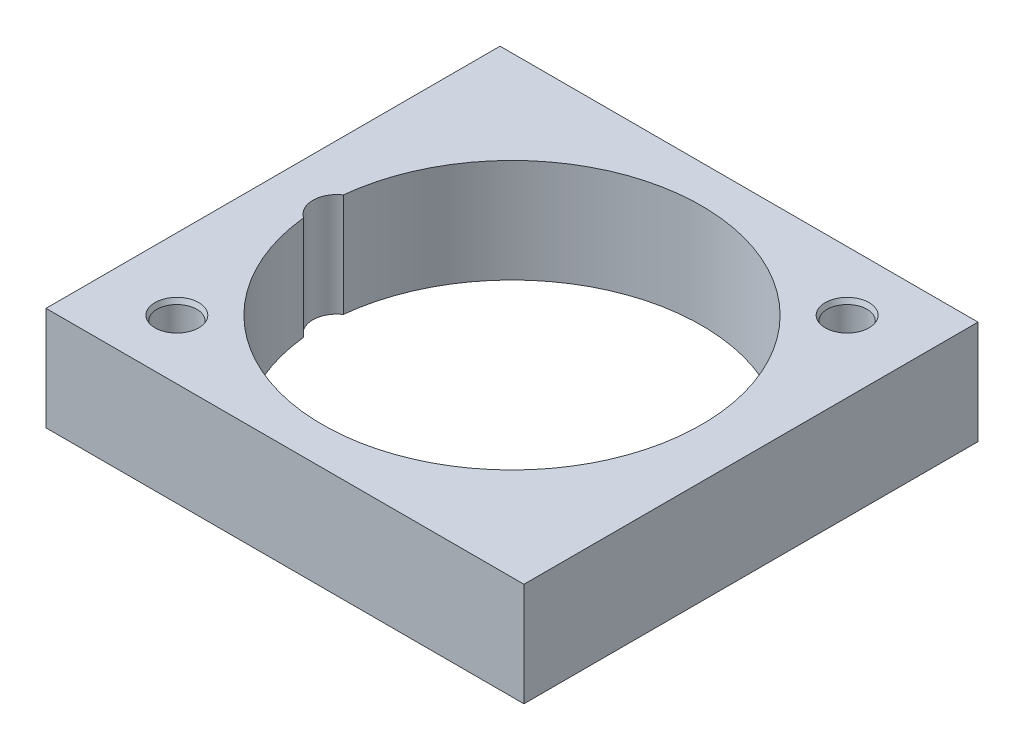
ISO-10303-21;
HEADER;
FILE_DESCRIPTION(('STEP AP214'),'2;1');
FILE_NAME('part.step','',(''),(''),'','','');
FILE_SCHEMA(('AUTOMOTIVE_DESIGN { 1 0 10303 214 1 1 1 1 }'));
ENDSEC;
DATA;
#1=APPLICATION_CONTEXT('core data for automotive mechanical design processes');
#2=APPLICATION_PROTOCOL_DEFINITION('international standard','automotive_design',2000,#1);
#3=PRODUCT_CONTEXT('',#1,'mechanical');
#4=PRODUCT('Part','Part','',(#3));
#5=PRODUCT_RELATED_PRODUCT_CATEGORY('part','',(#4));
#6=PRODUCT_DEFINITION_FORMATION('','',#4);
#7=PRODUCT_DEFINITION_CONTEXT('part definition',#1,'design');
#8=PRODUCT_DEFINITION('design','',#6,#7);
#9=PRODUCT_DEFINITION_SHAPE('','',#8);
#10=(LENGTH_UNIT() NAMED_UNIT(*) SI_UNIT(.MILLI.,.METRE.));
#11=(NAMED_UNIT(*) PLANE_ANGLE_UNIT() SI_UNIT($,.RADIAN.));
#12=(NAMED_UNIT(*) SI_UNIT($,.STERADIAN.) SOLID_ANGLE_UNIT());
#13=UNCERTAINTY_MEASURE_WITH_UNIT(LENGTH_MEASURE(1.E-05),#10,'distance_accuracy_value','');
#14=(GEOMETRIC_REPRESENTATION_CONTEXT(3) GLOBAL_UNCERTAINTY_ASSIGNED_CONTEXT((#13)) GLOBAL_UNIT_ASSIGNED_CONTEXT((#10,
#11,#12)) REPRESENTATION_CONTEXT('',''));
#15=CARTESIAN_POINT('',(0.,0.,0.));
#16=DIRECTION('',(0.,0.,1.));
#17=DIRECTION('',(1.,0.,0.));
#18=AXIS2_PLACEMENT_3D('',#15,#16,#17);
#19=CARTESIAN_POINT('',(30.,13.,-28.5));
#20=DIRECTION('',(0.,1.,0.));
#21=DIRECTION('',(0.,0.,1.));
#22=AXIS2_PLACEMENT_3D('',#19,#20,#21);
#23=PLANE('',#22);
#24=CARTESIAN_POINT('',(-21.0364267402999,13.,21.0364267402997));
#25=DIRECTION('',(0.,1.,0.));
#26=DIRECTION('',(0.,0.,1.));
#27=AXIS2_PLACEMENT_3D('',#24,#25,#26);
#28=CIRCLE('',#27,2.75);
#29=CARTESIAN_POINT('',(-21.0364267402999,13.,23.7864267402997));
#30=VERTEX_POINT('',#29);
#31=EDGE_CURVE('E105',#30,#30,#28,.T.);
#32=ORIENTED_EDGE('',*,*,#31,.F.);
#33=EDGE_LOOP('',(#32));
#34=FACE_BOUND('',#33,.T.);
#35=CARTESIAN_POINT('',(21.0364267402997,13.,-21.0364267402998));
#36=DIRECTION('',(0.,1.,0.));
#37=DIRECTION('',(0.,0.,1.));
#38=AXIS2_PLACEMENT_3D('',#35,#36,#37);
#39=CIRCLE('',#38,2.75);
#40=CARTESIAN_POINT('',(21.0364267402997,13.,-18.2864267402998));
#41=VERTEX_POINT('',#40);
#42=EDGE_CURVE('E116',#41,#41,#39,.T.);
#43=ORIENTED_EDGE('',*,*,#42,.F.);
#44=EDGE_LOOP('',(#43));
#45=FACE_BOUND('',#44,.T.);
#46=DIRECTION('',(0.,0.,-1.));
#47=VECTOR('',#46,1.);
#48=CARTESIAN_POINT('',(30.,13.,28.5));
#49=LINE('',#48,#47);
#50=CARTESIAN_POINT('',(30.,13.,28.5));
#51=VERTEX_POINT('',#50);
#52=CARTESIAN_POINT('',(30.,13.,-28.5));
#53=VERTEX_POINT('',#52);
#54=EDGE_CURVE('E141',#51,#53,#49,.T.);
#55=ORIENTED_EDGE('',*,*,#54,.T.);
#56=DIRECTION('',(-1.,0.,0.));
#57=VECTOR('',#56,1.);
#58=CARTESIAN_POINT('',(30.,13.,-28.5));
#59=LINE('',#58,#57);
#60=CARTESIAN_POINT('',(-30.,13.,-28.5));
#61=VERTEX_POINT('',#60);
#62=EDGE_CURVE('E144',#53,#61,#59,.T.);
#63=ORIENTED_EDGE('',*,*,#62,.T.);
#64=DIRECTION('',(0.,0.,1.));
#65=VECTOR('',#64,1.);
#66=CARTESIAN_POINT('',(-30.,13.,28.5));
#67=LINE('',#66,#65);
#68=CARTESIAN_POINT('',(-30.,13.,28.5));
#69=VERTEX_POINT('',#68);
#70=EDGE_CURVE('E146',#61,#69,#67,.T.);
#71=ORIENTED_EDGE('',*,*,#70,.T.);
#72=DIRECTION('',(1.,0.,0.));
#73=VECTOR('',#72,1.);
#74=CARTESIAN_POINT('',(30.,13.,28.5));
#75=LINE('',#74,#73);
#76=EDGE_CURVE('E149',#69,#51,#75,.T.);
#77=ORIENTED_EDGE('',*,*,#76,.T.);
#78=EDGE_LOOP('',(#55,#63,#71,#77));
#79=FACE_BOUND('',#78,.T.);
#80=CARTESIAN_POINT('',(0.,13.,0.));
#81=DIRECTION('',(0.,1.,0.));
#82=DIRECTION('',(0.,0.,-1.));
#83=AXIS2_PLACEMENT_3D('',#80,#81,#82);
#84=CIRCLE('',#83,23.8);
#85=CARTESIAN_POINT('',(-23.6690909090909,13.,2.49281678773032));
#86=VERTEX_POINT('',#85);
#87=CARTESIAN_POINT('',(-23.6690909090909,13.,-2.49281678773031));
#88=VERTEX_POINT('',#87);
#89=EDGE_CURVE('E125',#86,#88,#84,.T.);
#90=ORIENTED_EDGE('',*,*,#89,.F.);
#91=CARTESIAN_POINT('',(-22.,13.,0.));
#92=DIRECTION('',(0.,1.,0.));
#93=DIRECTION('',(0.,0.,-1.));
#94=AXIS2_PLACEMENT_3D('',#91,#92,#93);
#95=CIRCLE('',#94,3.00000000000001);
#96=EDGE_CURVE('E123',#88,#86,#95,.T.);
#97=ORIENTED_EDGE('',*,*,#96,.F.);
#98=EDGE_LOOP('',(#90,#97));
#99=FACE_BOUND('',#98,.T.);
#100=ADVANCED_FACE('F35',(#34,#45,#79,#99),#23,.T.);
#101=CARTESIAN_POINT('',(30.,0.,-28.5));
#102=DIRECTION('',(0.,1.,0.));
#103=DIRECTION('',(0.,0.,1.));
#104=AXIS2_PLACEMENT_3D('',#101,#102,#103);
#105=PLANE('',#104);
#106=DIRECTION('',(0.,0.,-1.));
#107=VECTOR('',#106,1.);
#108=CARTESIAN_POINT('',(30.,0.,28.5));
#109=LINE('',#108,#107);
#110=CARTESIAN_POINT('',(30.,0.,28.5));
#111=VERTEX_POINT('',#110);
#112=CARTESIAN_POINT('',(30.,0.,-28.5));
#113=VERTEX_POINT('',#112);
#114=EDGE_CURVE('E131',#111,#113,#109,.T.);
#115=ORIENTED_EDGE('',*,*,#114,.F.);
#116=DIRECTION('',(1.,0.,0.));
#117=VECTOR('',#116,1.);
#118=CARTESIAN_POINT('',(30.,0.,28.5));
#119=LINE('',#118,#117);
#120=CARTESIAN_POINT('',(-30.,0.,28.5));
#121=VERTEX_POINT('',#120);
#122=EDGE_CURVE('E138',#121,#111,#119,.T.);
#123=ORIENTED_EDGE('',*,*,#122,.F.);
#124=DIRECTION('',(0.,0.,1.));
#125=VECTOR('',#124,1.);
#126=CARTESIAN_POINT('',(-30.,0.,28.5));
#127=LINE('',#126,#125);
#128=CARTESIAN_POINT('',(-30.,0.,-28.5));
#129=VERTEX_POINT('',#128);
#130=EDGE_CURVE('E136',#129,#121,#127,.T.);
#131=ORIENTED_EDGE('',*,*,#130,.F.);
#132=DIRECTION('',(-1.,0.,0.));
#133=VECTOR('',#132,1.);
#134=CARTESIAN_POINT('',(30.,0.,-28.5));
#135=LINE('',#134,#133);
#136=EDGE_CURVE('E134',#113,#129,#135,.T.);
#137=ORIENTED_EDGE('',*,*,#136,.F.);
#138=EDGE_LOOP('',(#115,#123,#131,#137));
#139=FACE_BOUND('',#138,.T.);
#140=CARTESIAN_POINT('',(-22.,0.,0.));
#141=DIRECTION('',(0.,1.,0.));
#142=DIRECTION('',(0.,0.,-1.));
#143=AXIS2_PLACEMENT_3D('',#140,#141,#142);
#144=CIRCLE('',#143,3.00000000000001);
#145=CARTESIAN_POINT('',(-23.6690909090909,0.,-2.49281678773031));
#146=VERTEX_POINT('',#145);
#147=CARTESIAN_POINT('',(-23.6690909090909,0.,2.49281678773032));
#148=VERTEX_POINT('',#147);
#149=EDGE_CURVE('E57',#146,#148,#144,.T.);
#150=ORIENTED_EDGE('',*,*,#149,.T.);
#151=CARTESIAN_POINT('',(0.,0.,0.));
#152=DIRECTION('',(0.,1.,0.));
#153=DIRECTION('',(0.,0.,-1.));
#154=AXIS2_PLACEMENT_3D('',#151,#152,#153);
#155=CIRCLE('',#154,23.8);
#156=EDGE_CURVE('E120',#148,#146,#155,.T.);
#157=ORIENTED_EDGE('',*,*,#156,.T.);
#158=EDGE_LOOP('',(#150,#157));
#159=FACE_BOUND('',#158,.T.);
#160=ADVANCED_FACE('F167',(#139,#159),#105,.F.);
#161=CARTESIAN_POINT('',(30.,13.,28.5));
#162=DIRECTION('',(-1.,0.,0.));
#163=DIRECTION('',(0.,0.,1.));
#164=AXIS2_PLACEMENT_3D('',#161,#162,#163);
#165=PLANE('',#164);
#166=ORIENTED_EDGE('',*,*,#114,.T.);
#167=DIRECTION('',(0.,-1.,0.));
#168=VECTOR('',#167,1.);
#169=CARTESIAN_POINT('',(30.,13.,-28.5));
#170=LINE('',#169,#168);
#171=EDGE_CURVE('E11',#53,#113,#170,.T.);
#172=ORIENTED_EDGE('',*,*,#171,.F.);
#173=ORIENTED_EDGE('',*,*,#54,.F.);
#174=DIRECTION('',(0.,-1.,0.));
#175=VECTOR('',#174,1.);
#176=CARTESIAN_POINT('',(30.,13.,28.5));
#177=LINE('',#176,#175);
#178=EDGE_CURVE('E151',#51,#111,#177,.T.);
#179=ORIENTED_EDGE('',*,*,#178,.T.);
#180=EDGE_LOOP('',(#166,#172,#173,#179));
#181=FACE_BOUND('',#180,.T.);
#182=ADVANCED_FACE('F37',(#181),#165,.F.);
#183=CARTESIAN_POINT('',(30.,13.,-28.5));
#184=DIRECTION('',(0.,0.,1.));
#185=DIRECTION('',(1.,0.,0.));
#186=AXIS2_PLACEMENT_3D('',#183,#184,#185);
#187=PLANE('',#186);
#188=ORIENTED_EDGE('',*,*,#136,.T.);
#189=DIRECTION('',(0.,-1.,0.));
#190=VECTOR('',#189,1.);
#191=CARTESIAN_POINT('',(-30.,13.,-28.5));
#192=LINE('',#191,#190);
#193=EDGE_CURVE('E43',#61,#129,#192,.T.);
#194=ORIENTED_EDGE('',*,*,#193,.F.);
#195=ORIENTED_EDGE('',*,*,#62,.F.);
#196=ORIENTED_EDGE('',*,*,#171,.T.);
#197=EDGE_LOOP('',(#188,#194,#195,#196));
#198=FACE_BOUND('',#197,.T.);
#199=ADVANCED_FACE('F178',(#198),#187,.F.);
#200=CARTESIAN_POINT('',(-30.,13.,28.5));
#201=DIRECTION('',(1.,0.,0.));
#202=DIRECTION('',(0.,0.,-1.));
#203=AXIS2_PLACEMENT_3D('',#200,#201,#202);
#204=PLANE('',#203);
#205=ORIENTED_EDGE('',*,*,#130,.T.);
#206=DIRECTION('',(0.,-1.,0.));
#207=VECTOR('',#206,1.);
#208=CARTESIAN_POINT('',(-30.,13.,28.5));
#209=LINE('',#208,#207);
#210=EDGE_CURVE('E154',#69,#121,#209,.T.);
#211=ORIENTED_EDGE('',*,*,#210,.F.);
#212=ORIENTED_EDGE('',*,*,#70,.F.);
#213=ORIENTED_EDGE('',*,*,#193,.T.);
#214=EDGE_LOOP('',(#205,#211,#212,#213));
#215=FACE_BOUND('',#214,.T.);
#216=ADVANCED_FACE('F161',(#215),#204,.F.);
#217=CARTESIAN_POINT('',(30.,13.,28.5));
#218=DIRECTION('',(0.,0.,-1.));
#219=DIRECTION('',(-1.,0.,0.));
#220=AXIS2_PLACEMENT_3D('',#217,#218,#219);
#221=PLANE('',#220);
#222=ORIENTED_EDGE('',*,*,#122,.T.);
#223=ORIENTED_EDGE('',*,*,#178,.F.);
#224=ORIENTED_EDGE('',*,*,#76,.F.);
#225=ORIENTED_EDGE('',*,*,#210,.T.);
#226=EDGE_LOOP('',(#222,#223,#224,#225));
#227=FACE_BOUND('',#226,.T.);
#228=ADVANCED_FACE('F171',(#227),#221,.F.);
#229=CARTESIAN_POINT('',(-22.,13.,0.));
#230=DIRECTION('',(0.,-1.,0.));
#231=DIRECTION('',(0.,0.,-1.));
#232=AXIS2_PLACEMENT_3D('',#229,#230,#231);
#233=CYLINDRICAL_SURFACE('',#232,3.00000000000001);
#234=ORIENTED_EDGE('',*,*,#149,.F.);
#235=DIRECTION('',(0.,-1.,0.));
#236=VECTOR('',#235,1.);
#237=CARTESIAN_POINT('',(-23.6690909090909,13.,-2.49281678773031));
#238=LINE('',#237,#236);
#239=EDGE_CURVE('E128',#88,#146,#238,.T.);
#240=ORIENTED_EDGE('',*,*,#239,.F.);
#241=ORIENTED_EDGE('',*,*,#96,.T.);
#242=DIRECTION('',(0.,-1.,0.));
#243=VECTOR('',#242,1.);
#244=CARTESIAN_POINT('',(-23.6690909090909,13.,2.49281678773032));
#245=LINE('',#244,#243);
#246=EDGE_CURVE('E50',#86,#148,#245,.T.);
#247=ORIENTED_EDGE('',*,*,#246,.T.);
#248=EDGE_LOOP('',(#234,#240,#241,#247));
#249=FACE_BOUND('',#248,.T.);
#250=ADVANCED_FACE('F197',(#249),#233,.F.);
#251=CARTESIAN_POINT('',(0.,13.,0.));
#252=DIRECTION('',(0.,-1.,0.));
#253=DIRECTION('',(0.,0.,-1.));
#254=AXIS2_PLACEMENT_3D('',#251,#252,#253);
#255=CYLINDRICAL_SURFACE('',#254,23.8);
#256=ORIENTED_EDGE('',*,*,#156,.F.);
#257=ORIENTED_EDGE('',*,*,#246,.F.);
#258=ORIENTED_EDGE('',*,*,#89,.T.);
#259=ORIENTED_EDGE('',*,*,#239,.T.);
#260=EDGE_LOOP('',(#256,#257,#258,#259));
#261=FACE_BOUND('',#260,.T.);
#262=ADVANCED_FACE('F201',(#261),#255,.F.);
#263=CARTESIAN_POINT('',(21.0364267402997,13.,-21.0364267402998));
#264=DIRECTION('',(0.,1.,0.));
#265=DIRECTION('',(0.,0.,1.));
#266=AXIS2_PLACEMENT_3D('',#263,#264,#265);
#267=CONICAL_SURFACE('',#266,2.75,0.392699081698728);
#268=CARTESIAN_POINT('',(21.0364267402997,12.3964466094067,-21.0364267402998));
#269=DIRECTION('',(0.,1.,0.));
#270=DIRECTION('',(0.,0.,1.));
#271=AXIS2_PLACEMENT_3D('',#268,#269,#270);
#272=CIRCLE('',#271,2.5);
#273=CARTESIAN_POINT('',(21.0364267402997,12.3964466094067,-18.5364267402998));
#274=VERTEX_POINT('',#273);
#275=EDGE_CURVE('E113',#274,#274,#272,.T.);
#276=ORIENTED_EDGE('',*,*,#275,.F.);
#277=EDGE_LOOP('',(#276));
#278=FACE_BOUND('',#277,.T.);
#279=ORIENTED_EDGE('',*,*,#42,.T.);
#280=EDGE_LOOP('',(#279));
#281=FACE_BOUND('',#280,.T.);
#282=ADVANCED_FACE('F205',(#278,#281),#267,.F.);
#283=CARTESIAN_POINT('',(21.0364267402997,13.,-21.0364267402998));
#284=DIRECTION('',(0.,1.,0.));
#285=DIRECTION('',(0.,0.,1.));
#286=AXIS2_PLACEMENT_3D('',#283,#284,#285);
#287=CYLINDRICAL_SURFACE('',#286,2.5);
#288=CARTESIAN_POINT('',(21.0364267402997,5.,-21.0364267402998));
#289=DIRECTION('',(0.,1.,0.));
#290=DIRECTION('',(0.,0.,1.));
#291=AXIS2_PLACEMENT_3D('',#288,#289,#290);
#292=CIRCLE('',#291,2.5);
#293=CARTESIAN_POINT('',(21.0364267402997,5.,-18.5364267402998));
#294=VERTEX_POINT('',#293);
#295=EDGE_CURVE('E110',#294,#294,#292,.T.);
#296=ORIENTED_EDGE('',*,*,#295,.F.);
#297=EDGE_LOOP('',(#296));
#298=FACE_BOUND('',#297,.T.);
#299=ORIENTED_EDGE('',*,*,#275,.T.);
#300=EDGE_LOOP('',(#299));
#301=FACE_BOUND('',#300,.T.);
#302=ADVANCED_FACE('F210',(#298,#301),#287,.F.);
#303=CARTESIAN_POINT('',(21.0364267402997,5.,-21.0364267402998));
#304=DIRECTION('',(0.,1.,0.));
#305=DIRECTION('',(0.,0.,1.));
#306=AXIS2_PLACEMENT_3D('',#303,#304,#305);
#307=CONICAL_SURFACE('',#306,2.5,1.02974425867665);
#308=CARTESIAN_POINT('',(21.0364267402997,3.4978484524311,-21.0364267402998));
#309=VERTEX_POINT('',#308);
#310=VERTEX_LOOP('',#309);
#311=FACE_BOUND('',#310,.T.);
#312=ORIENTED_EDGE('',*,*,#295,.T.);
#313=EDGE_LOOP('',(#312));
#314=FACE_BOUND('',#313,.T.);
#315=ADVANCED_FACE('F214',(#311,#314),#307,.F.);
#316=CARTESIAN_POINT('',(-21.0364267402999,13.,21.0364267402997));
#317=DIRECTION('',(0.,1.,0.));
#318=DIRECTION('',(0.,0.,1.));
#319=AXIS2_PLACEMENT_3D('',#316,#317,#318);
#320=CONICAL_SURFACE('',#319,2.75,0.392699081698728);
#321=CARTESIAN_POINT('',(-21.0364267402999,12.3964466094067,21.0364267402997));
#322=DIRECTION('',(0.,1.,0.));
#323=DIRECTION('',(0.,0.,1.));
#324=AXIS2_PLACEMENT_3D('',#321,#322,#323);
#325=CIRCLE('',#324,2.5);
#326=CARTESIAN_POINT('',(-21.0364267402999,12.3964466094067,23.5364267402997));
#327=VERTEX_POINT('',#326);
#328=EDGE_CURVE('E102',#327,#327,#325,.T.);
#329=ORIENTED_EDGE('',*,*,#328,.F.);
#330=EDGE_LOOP('',(#329));
#331=FACE_BOUND('',#330,.T.);
#332=ORIENTED_EDGE('',*,*,#31,.T.);
#333=EDGE_LOOP('',(#332));
#334=FACE_BOUND('',#333,.T.);
#335=ADVANCED_FACE('F218',(#331,#334),#320,.F.);
#336=CARTESIAN_POINT('',(-21.0364267402999,13.,21.0364267402997));
#337=DIRECTION('',(0.,1.,0.));
#338=DIRECTION('',(0.,0.,1.));
#339=AXIS2_PLACEMENT_3D('',#336,#337,#338);
#340=CYLINDRICAL_SURFACE('',#339,2.5);
#341=CARTESIAN_POINT('',(-21.0364267402999,5.,21.0364267402997));
#342=DIRECTION('',(0.,1.,0.));
#343=DIRECTION('',(0.,0.,1.));
#344=AXIS2_PLACEMENT_3D('',#341,#342,#343);
#345=CIRCLE('',#344,2.5);
#346=CARTESIAN_POINT('',(-21.0364267402999,5.,23.5364267402997));
#347=VERTEX_POINT('',#346);
#348=EDGE_CURVE('E100',#347,#347,#345,.T.);
#349=ORIENTED_EDGE('',*,*,#348,.F.);
#350=EDGE_LOOP('',(#349));
#351=FACE_BOUND('',#350,.T.);
#352=ORIENTED_EDGE('',*,*,#328,.T.);
#353=EDGE_LOOP('',(#352));
#354=FACE_BOUND('',#353,.T.);
#355=ADVANCED_FACE('F96',(#351,#354),#340,.F.);
#356=CARTESIAN_POINT('',(-21.0364267402999,5.,21.0364267402997));
#357=DIRECTION('',(0.,1.,0.));
#358=DIRECTION('',(0.,0.,1.));
#359=AXIS2_PLACEMENT_3D('',#356,#357,#358);
#360=CONICAL_SURFACE('',#359,2.5,1.02974425867665);
#361=CARTESIAN_POINT('',(-21.0364267402999,3.4978484524311,21.0364267402997));
#362=VERTEX_POINT('',#361);
#363=VERTEX_LOOP('',#362);
#364=FACE_BOUND('',#363,.T.);
#365=ORIENTED_EDGE('',*,*,#348,.T.);
#366=EDGE_LOOP('',(#365));
#367=FACE_BOUND('',#366,.T.);
#368=ADVANCED_FACE('F93',(#364,#367),#360,.F.);
#369=CLOSED_SHELL('',(#100,#160,#182,#199,#216,#228,#250,#262,#282,#302,#315,#335,#355,#368));
#370=MANIFOLD_SOLID_BREP('B2',#369);
#371=ADVANCED_BREP_SHAPE_REPRESENTATION('',(#18,#370),#14);
#372=SHAPE_DEFINITION_REPRESENTATION(#9,#371);
ENDSEC;
END-ISO-10303-21;
